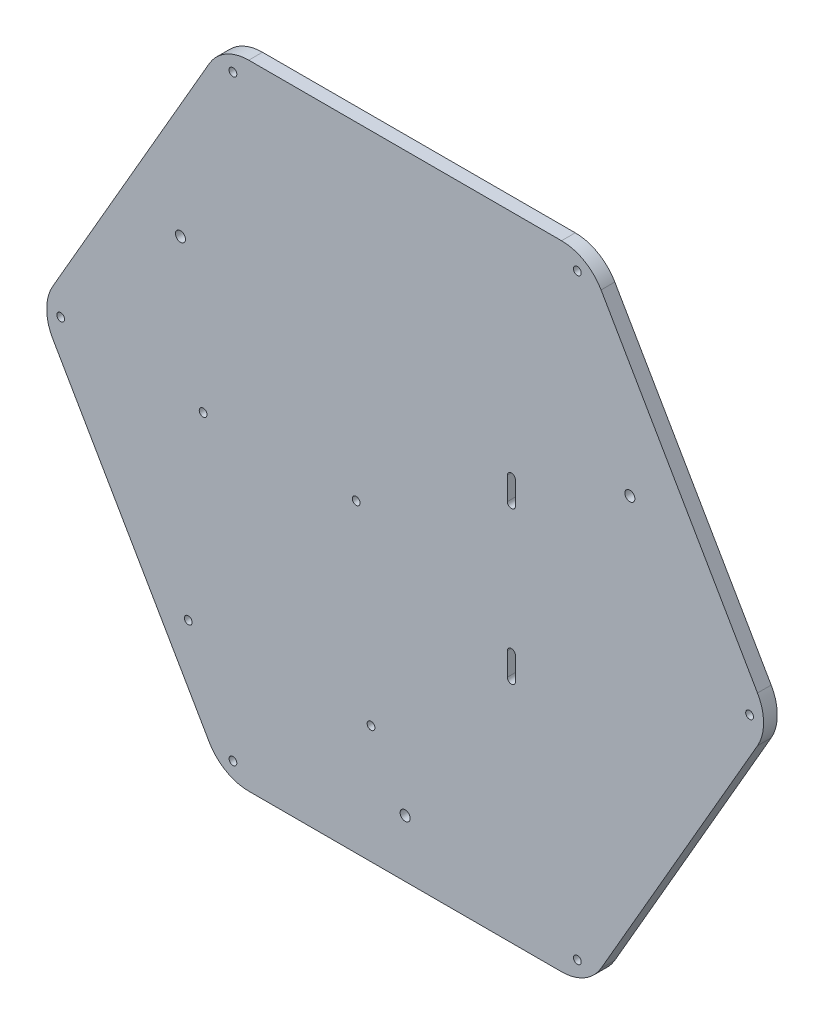
ISO-10303-21;
HEADER;
FILE_DESCRIPTION(('STEP AP214'),'2;1');
FILE_NAME('part.step','',(''),(''),'','','');
FILE_SCHEMA(('AUTOMOTIVE_DESIGN { 1 0 10303 214 1 1 1 1 }'));
ENDSEC;
DATA;
#1=APPLICATION_CONTEXT('core data for automotive mechanical design processes');
#2=APPLICATION_PROTOCOL_DEFINITION('international standard','automotive_design',2000,#1);
#3=PRODUCT_CONTEXT('',#1,'mechanical');
#4=PRODUCT('Part','Part','',(#3));
#5=PRODUCT_RELATED_PRODUCT_CATEGORY('part','',(#4));
#6=PRODUCT_DEFINITION_FORMATION('','',#4);
#7=PRODUCT_DEFINITION_CONTEXT('part definition',#1,'design');
#8=PRODUCT_DEFINITION('design','',#6,#7);
#9=PRODUCT_DEFINITION_SHAPE('','',#8);
#10=(LENGTH_UNIT() NAMED_UNIT(*) SI_UNIT(.MILLI.,.METRE.));
#11=(NAMED_UNIT(*) PLANE_ANGLE_UNIT() SI_UNIT($,.RADIAN.));
#12=(NAMED_UNIT(*) SI_UNIT($,.STERADIAN.) SOLID_ANGLE_UNIT());
#13=UNCERTAINTY_MEASURE_WITH_UNIT(LENGTH_MEASURE(1.E-05),#10,'distance_accuracy_value','');
#14=(GEOMETRIC_REPRESENTATION_CONTEXT(3) GLOBAL_UNCERTAINTY_ASSIGNED_CONTEXT((#13)) GLOBAL_UNIT_ASSIGNED_CONTEXT((#10,
#11,#12)) REPRESENTATION_CONTEXT('',''));
#15=CARTESIAN_POINT('',(0.,0.,0.));
#16=DIRECTION('',(0.,0.,1.));
#17=DIRECTION('',(1.,0.,0.));
#18=AXIS2_PLACEMENT_3D('',#15,#16,#17);
#19=CARTESIAN_POINT('',(160.,0.,6.));
#20=DIRECTION('',(-0.866025403784439,-0.5,0.));
#21=DIRECTION('',(0.5,-0.866025403784439,0.));
#22=AXIS2_PLACEMENT_3D('',#19,#20,#21);
#23=PLANE('',#22);
#24=DIRECTION('',(-0.5,0.866025403784439,0.));
#25=VECTOR('',#24,1.);
#26=CARTESIAN_POINT('',(160.,0.,0.));
#27=LINE('',#26,#25);
#28=CARTESIAN_POINT('',(154.226497308104,10.,0.));
#29=VERTEX_POINT('',#28);
#30=CARTESIAN_POINT('',(85.7735026918963,128.56406460551,0.));
#31=VERTEX_POINT('',#30);
#32=EDGE_CURVE('E313',#29,#31,#27,.T.);
#33=ORIENTED_EDGE('',*,*,#32,.T.);
#34=DIRECTION('',(0.,0.,-1.));
#35=VECTOR('',#34,1.);
#36=CARTESIAN_POINT('',(85.7735026918963,128.56406460551,6.));
#37=LINE('',#36,#35);
#38=CARTESIAN_POINT('',(85.7735026918963,128.56406460551,6.));
#39=VERTEX_POINT('',#38);
#40=EDGE_CURVE('E365',#31,#39,#37,.F.);
#41=ORIENTED_EDGE('',*,*,#40,.T.);
#42=DIRECTION('',(-0.5,0.866025403784439,0.));
#43=VECTOR('',#42,1.);
#44=CARTESIAN_POINT('',(160.,0.,6.));
#45=LINE('',#44,#43);
#46=CARTESIAN_POINT('',(154.226497308104,10.,6.));
#47=VERTEX_POINT('',#46);
#48=EDGE_CURVE('E287',#47,#39,#45,.T.);
#49=ORIENTED_EDGE('',*,*,#48,.F.);
#50=DIRECTION('',(0.,0.,-1.));
#51=VECTOR('',#50,1.);
#52=CARTESIAN_POINT('',(154.226497308104,10.,6.));
#53=LINE('',#52,#51);
#54=EDGE_CURVE('E361',#47,#29,#53,.T.);
#55=ORIENTED_EDGE('',*,*,#54,.T.);
#56=EDGE_LOOP('',(#33,#41,#49,#55));
#57=FACE_BOUND('',#56,.T.);
#58=ADVANCED_FACE('F38',(#57),#23,.F.);
#59=CARTESIAN_POINT('',(80.,138.56406460551,6.));
#60=DIRECTION('',(0.,-1.,0.));
#61=DIRECTION('',(1.,0.,0.));
#62=AXIS2_PLACEMENT_3D('',#59,#60,#61);
#63=PLANE('',#62);
#64=DIRECTION('',(-1.,0.,0.));
#65=VECTOR('',#64,1.);
#66=CARTESIAN_POINT('',(80.,138.56406460551,6.));
#67=LINE('',#66,#65);
#68=CARTESIAN_POINT('',(68.4529946162075,138.56406460551,6.));
#69=VERTEX_POINT('',#68);
#70=CARTESIAN_POINT('',(-68.4529946162075,138.56406460551,6.));
#71=VERTEX_POINT('',#70);
#72=EDGE_CURVE('E291',#69,#71,#67,.T.);
#73=ORIENTED_EDGE('',*,*,#72,.F.);
#74=DIRECTION('',(0.,0.,-1.));
#75=VECTOR('',#74,1.);
#76=CARTESIAN_POINT('',(68.4529946162075,138.56406460551,6.));
#77=LINE('',#76,#75);
#78=CARTESIAN_POINT('',(68.4529946162075,138.56406460551,0.));
#79=VERTEX_POINT('',#78);
#80=EDGE_CURVE('E339',#69,#79,#77,.T.);
#81=ORIENTED_EDGE('',*,*,#80,.T.);
#82=DIRECTION('',(-1.,0.,0.));
#83=VECTOR('',#82,1.);
#84=CARTESIAN_POINT('',(80.,138.56406460551,0.));
#85=LINE('',#84,#83);
#86=CARTESIAN_POINT('',(-68.4529946162075,138.56406460551,0.));
#87=VERTEX_POINT('',#86);
#88=EDGE_CURVE('E317',#79,#87,#85,.T.);
#89=ORIENTED_EDGE('',*,*,#88,.T.);
#90=DIRECTION('',(0.,0.,-1.));
#91=VECTOR('',#90,1.);
#92=CARTESIAN_POINT('',(-68.4529946162075,138.56406460551,6.));
#93=LINE('',#92,#91);
#94=EDGE_CURVE('E312',#87,#71,#93,.F.);
#95=ORIENTED_EDGE('',*,*,#94,.T.);
#96=EDGE_LOOP('',(#73,#81,#89,#95));
#97=FACE_BOUND('',#96,.T.);
#98=ADVANCED_FACE('F502',(#97),#63,.F.);
#99=CARTESIAN_POINT('',(-80.,138.56406460551,6.));
#100=DIRECTION('',(0.866025403784439,-0.5,0.));
#101=DIRECTION('',(0.5,0.866025403784439,0.));
#102=AXIS2_PLACEMENT_3D('',#99,#100,#101);
#103=PLANE('',#102);
#104=DIRECTION('',(-0.5,-0.866025403784439,0.));
#105=VECTOR('',#104,1.);
#106=CARTESIAN_POINT('',(-80.,138.56406460551,6.));
#107=LINE('',#106,#105);
#108=CARTESIAN_POINT('',(-85.7735026918963,128.56406460551,6.));
#109=VERTEX_POINT('',#108);
#110=CARTESIAN_POINT('',(-154.226497308104,9.99999999999995,6.));
#111=VERTEX_POINT('',#110);
#112=EDGE_CURVE('E296',#109,#111,#107,.T.);
#113=ORIENTED_EDGE('',*,*,#112,.F.);
#114=DIRECTION('',(0.,0.,-1.));
#115=VECTOR('',#114,1.);
#116=CARTESIAN_POINT('',(-85.7735026918963,128.56406460551,6.));
#117=LINE('',#116,#115);
#118=CARTESIAN_POINT('',(-85.7735026918963,128.56406460551,0.));
#119=VERTEX_POINT('',#118);
#120=EDGE_CURVE('E389',#109,#119,#117,.T.);
#121=ORIENTED_EDGE('',*,*,#120,.T.);
#122=DIRECTION('',(-0.5,-0.866025403784439,0.));
#123=VECTOR('',#122,1.);
#124=CARTESIAN_POINT('',(-80.,138.56406460551,0.));
#125=LINE('',#124,#123);
#126=CARTESIAN_POINT('',(-154.226497308104,9.99999999999995,0.));
#127=VERTEX_POINT('',#126);
#128=EDGE_CURVE('E322',#119,#127,#125,.T.);
#129=ORIENTED_EDGE('',*,*,#128,.T.);
#130=DIRECTION('',(0.,0.,-1.));
#131=VECTOR('',#130,1.);
#132=CARTESIAN_POINT('',(-154.226497308104,9.99999999999995,6.));
#133=LINE('',#132,#131);
#134=EDGE_CURVE('E386',#127,#111,#133,.F.);
#135=ORIENTED_EDGE('',*,*,#134,.T.);
#136=EDGE_LOOP('',(#113,#121,#129,#135));
#137=FACE_BOUND('',#136,.T.);
#138=ADVANCED_FACE('F508',(#137),#103,.F.);
#139=CARTESIAN_POINT('',(-160.,0.,6.));
#140=DIRECTION('',(0.866025403784438,0.5,0.));
#141=DIRECTION('',(-0.5,0.866025403784439,0.));
#142=AXIS2_PLACEMENT_3D('',#139,#140,#141);
#143=PLANE('',#142);
#144=DIRECTION('',(0.5,-0.866025403784439,0.));
#145=VECTOR('',#144,1.);
#146=CARTESIAN_POINT('',(-160.,0.,6.));
#147=LINE('',#146,#145);
#148=CARTESIAN_POINT('',(-154.226497308104,-10.,6.));
#149=VERTEX_POINT('',#148);
#150=CARTESIAN_POINT('',(-85.7735026918962,-128.56406460551,6.));
#151=VERTEX_POINT('',#150);
#152=EDGE_CURVE('E300',#149,#151,#147,.T.);
#153=ORIENTED_EDGE('',*,*,#152,.F.);
#154=DIRECTION('',(0.,0.,-1.));
#155=VECTOR('',#154,1.);
#156=CARTESIAN_POINT('',(-154.226497308104,-10.,6.));
#157=LINE('',#156,#155);
#158=CARTESIAN_POINT('',(-154.226497308104,-10.,0.));
#159=VERTEX_POINT('',#158);
#160=EDGE_CURVE('E396',#149,#159,#157,.T.);
#161=ORIENTED_EDGE('',*,*,#160,.T.);
#162=DIRECTION('',(0.5,-0.866025403784439,0.));
#163=VECTOR('',#162,1.);
#164=CARTESIAN_POINT('',(-160.,0.,0.));
#165=LINE('',#164,#163);
#166=CARTESIAN_POINT('',(-85.7735026918962,-128.56406460551,0.));
#167=VERTEX_POINT('',#166);
#168=EDGE_CURVE('E326',#159,#167,#165,.T.);
#169=ORIENTED_EDGE('',*,*,#168,.T.);
#170=DIRECTION('',(0.,0.,-1.));
#171=VECTOR('',#170,1.);
#172=CARTESIAN_POINT('',(-85.7735026918962,-128.56406460551,6.));
#173=LINE('',#172,#171);
#174=EDGE_CURVE('E393',#167,#151,#173,.F.);
#175=ORIENTED_EDGE('',*,*,#174,.T.);
#176=EDGE_LOOP('',(#153,#161,#169,#175));
#177=FACE_BOUND('',#176,.T.);
#178=ADVANCED_FACE('F567',(#177),#143,.F.);
#179=CARTESIAN_POINT('',(-79.9999999999999,-138.56406460551,6.));
#180=DIRECTION('',(0.,1.,0.));
#181=DIRECTION('',(0.,0.,1.));
#182=AXIS2_PLACEMENT_3D('',#179,#180,#181);
#183=PLANE('',#182);
#184=DIRECTION('',(1.,0.,0.));
#185=VECTOR('',#184,1.);
#186=CARTESIAN_POINT('',(-79.9999999999999,-138.56406460551,6.));
#187=LINE('',#186,#185);
#188=CARTESIAN_POINT('',(-68.4529946162074,-138.56406460551,6.));
#189=VERTEX_POINT('',#188);
#190=CARTESIAN_POINT('',(68.4529946162075,-138.56406460551,6.));
#191=VERTEX_POINT('',#190);
#192=EDGE_CURVE('E304',#189,#191,#187,.T.);
#193=ORIENTED_EDGE('',*,*,#192,.F.);
#194=DIRECTION('',(0.,0.,-1.));
#195=VECTOR('',#194,1.);
#196=CARTESIAN_POINT('',(-68.4529946162074,-138.56406460551,6.));
#197=LINE('',#196,#195);
#198=CARTESIAN_POINT('',(-68.4529946162074,-138.56406460551,0.));
#199=VERTEX_POINT('',#198);
#200=EDGE_CURVE('E403',#189,#199,#197,.T.);
#201=ORIENTED_EDGE('',*,*,#200,.T.);
#202=DIRECTION('',(1.,0.,0.));
#203=VECTOR('',#202,1.);
#204=CARTESIAN_POINT('',(-79.9999999999999,-138.56406460551,0.));
#205=LINE('',#204,#203);
#206=CARTESIAN_POINT('',(68.4529946162075,-138.56406460551,0.));
#207=VERTEX_POINT('',#206);
#208=EDGE_CURVE('E330',#199,#207,#205,.T.);
#209=ORIENTED_EDGE('',*,*,#208,.T.);
#210=DIRECTION('',(0.,0.,-1.));
#211=VECTOR('',#210,1.);
#212=CARTESIAN_POINT('',(68.4529946162075,-138.56406460551,6.));
#213=LINE('',#212,#211);
#214=EDGE_CURVE('E400',#207,#191,#213,.F.);
#215=ORIENTED_EDGE('',*,*,#214,.T.);
#216=EDGE_LOOP('',(#193,#201,#209,#215));
#217=FACE_BOUND('',#216,.T.);
#218=ADVANCED_FACE('F572',(#217),#183,.F.);
#219=CARTESIAN_POINT('',(80.,-138.56406460551,6.));
#220=DIRECTION('',(-0.866025403784439,0.5,0.));
#221=DIRECTION('',(-0.5,-0.866025403784439,0.));
#222=AXIS2_PLACEMENT_3D('',#219,#220,#221);
#223=PLANE('',#222);
#224=DIRECTION('',(0.5,0.866025403784439,0.));
#225=VECTOR('',#224,1.);
#226=CARTESIAN_POINT('',(80.,-138.56406460551,6.));
#227=LINE('',#226,#225);
#228=CARTESIAN_POINT('',(85.7735026918963,-128.56406460551,6.));
#229=VERTEX_POINT('',#228);
#230=CARTESIAN_POINT('',(154.226497308104,-9.99999999999995,6.));
#231=VERTEX_POINT('',#230);
#232=EDGE_CURVE('E308',#229,#231,#227,.T.);
#233=ORIENTED_EDGE('',*,*,#232,.F.);
#234=DIRECTION('',(0.,0.,-1.));
#235=VECTOR('',#234,1.);
#236=CARTESIAN_POINT('',(85.7735026918963,-128.56406460551,6.));
#237=LINE('',#236,#235);
#238=CARTESIAN_POINT('',(85.7735026918963,-128.56406460551,0.));
#239=VERTEX_POINT('',#238);
#240=EDGE_CURVE('E410',#229,#239,#237,.T.);
#241=ORIENTED_EDGE('',*,*,#240,.T.);
#242=DIRECTION('',(0.5,0.866025403784439,0.));
#243=VECTOR('',#242,1.);
#244=CARTESIAN_POINT('',(80.,-138.56406460551,0.));
#245=LINE('',#244,#243);
#246=CARTESIAN_POINT('',(154.226497308104,-9.99999999999995,0.));
#247=VERTEX_POINT('',#246);
#248=EDGE_CURVE('E292',#239,#247,#245,.T.);
#249=ORIENTED_EDGE('',*,*,#248,.T.);
#250=DIRECTION('',(0.,0.,-1.));
#251=VECTOR('',#250,1.);
#252=CARTESIAN_POINT('',(154.226497308104,-9.99999999999998,6.));
#253=LINE('',#252,#251);
#254=EDGE_CURVE('E407',#247,#231,#253,.F.);
#255=ORIENTED_EDGE('',*,*,#254,.T.);
#256=EDGE_LOOP('',(#233,#241,#249,#255));
#257=FACE_BOUND('',#256,.T.);
#258=ADVANCED_FACE('F544',(#257),#223,.F.);
#259=CARTESIAN_POINT('',(0.,0.,6.));
#260=DIRECTION('',(0.,0.,1.));
#261=DIRECTION('',(1.,0.,0.));
#262=AXIS2_PLACEMENT_3D('',#259,#260,#261);
#263=PLANE('',#262);
#264=CARTESIAN_POINT('',(0.,-113.56406460551,6.));
#265=DIRECTION('',(0.,0.,1.));
#266=DIRECTION('',(1.,0.,0.));
#267=AXIS2_PLACEMENT_3D('',#264,#265,#266);
#268=CIRCLE('',#267,2.19999999999999);
#269=CARTESIAN_POINT('',(2.20000000000001,-113.56406460551,6.));
#270=VERTEX_POINT('',#269);
#271=EDGE_CURVE('E478',#270,#270,#268,.T.);
#272=ORIENTED_EDGE('',*,*,#271,.F.);
#273=EDGE_LOOP('',(#272));
#274=FACE_BOUND('',#273,.T.);
#275=CARTESIAN_POINT('',(-98.3493649053888,56.7820323027556,6.));
#276=DIRECTION('',(0.,0.,1.));
#277=DIRECTION('',(1.,0.,0.));
#278=AXIS2_PLACEMENT_3D('',#275,#276,#277);
#279=CIRCLE('',#278,2.19999999999999);
#280=CARTESIAN_POINT('',(-96.1493649053888,56.7820323027556,6.));
#281=VERTEX_POINT('',#280);
#282=EDGE_CURVE('E906',#281,#281,#279,.T.);
#283=ORIENTED_EDGE('',*,*,#282,.F.);
#284=EDGE_LOOP('',(#283));
#285=FACE_BOUND('',#284,.T.);
#286=CARTESIAN_POINT('',(98.3493649053896,56.7820323027542,6.));
#287=DIRECTION('',(0.,0.,1.));
#288=DIRECTION('',(1.,0.,0.));
#289=AXIS2_PLACEMENT_3D('',#286,#287,#288);
#290=CIRCLE('',#289,2.20000000000001);
#291=CARTESIAN_POINT('',(100.54936490539,56.7820323027542,6.));
#292=VERTEX_POINT('',#291);
#293=EDGE_CURVE('E840',#292,#292,#290,.T.);
#294=ORIENTED_EDGE('',*,*,#293,.F.);
#295=EDGE_LOOP('',(#294));
#296=FACE_BOUND('',#295,.T.);
#297=CARTESIAN_POINT('',(46.5,37.8083885373264,6.));
#298=DIRECTION('',(0.,0.,1.));
#299=DIRECTION('',(1.,0.,0.));
#300=AXIS2_PLACEMENT_3D('',#297,#298,#299);
#301=CIRCLE('',#300,1.75);
#302=CARTESIAN_POINT('',(48.25,37.8083885373264,6.));
#303=VERTEX_POINT('',#302);
#304=CARTESIAN_POINT('',(44.75,37.8083885373264,6.));
#305=VERTEX_POINT('',#304);
#306=EDGE_CURVE('E56',#303,#305,#301,.T.);
#307=ORIENTED_EDGE('',*,*,#306,.F.);
#308=DIRECTION('',(0.,1.,0.));
#309=VECTOR('',#308,1.);
#310=CARTESIAN_POINT('',(48.25,37.8083885373264,6.));
#311=LINE('',#310,#309);
#312=CARTESIAN_POINT('',(48.25,27.8083885373264,6.));
#313=VERTEX_POINT('',#312);
#314=EDGE_CURVE('E204',#313,#303,#311,.T.);
#315=ORIENTED_EDGE('',*,*,#314,.F.);
#316=CARTESIAN_POINT('',(46.5,27.8083885373264,6.));
#317=DIRECTION('',(0.,0.,1.));
#318=DIRECTION('',(1.,0.,0.));
#319=AXIS2_PLACEMENT_3D('',#316,#317,#318);
#320=CIRCLE('',#319,1.75);
#321=CARTESIAN_POINT('',(44.75,27.8083885373264,6.));
#322=VERTEX_POINT('',#321);
#323=EDGE_CURVE('E185',#322,#313,#320,.T.);
#324=ORIENTED_EDGE('',*,*,#323,.F.);
#325=DIRECTION('',(0.,-1.,0.));
#326=VECTOR('',#325,1.);
#327=CARTESIAN_POINT('',(44.75,37.8083885373264,6.));
#328=LINE('',#327,#326);
#329=EDGE_CURVE('E196',#305,#322,#328,.T.);
#330=ORIENTED_EDGE('',*,*,#329,.F.);
#331=EDGE_LOOP('',(#307,#315,#324,#330));
#332=FACE_BOUND('',#331,.T.);
#333=CARTESIAN_POINT('',(46.5,-38.75,6.));
#334=DIRECTION('',(0.,0.,1.));
#335=DIRECTION('',(-1.,0.,0.));
#336=AXIS2_PLACEMENT_3D('',#333,#334,#335);
#337=CIRCLE('',#336,1.75);
#338=CARTESIAN_POINT('',(44.75,-38.75,6.));
#339=VERTEX_POINT('',#338);
#340=CARTESIAN_POINT('',(48.25,-38.75,6.));
#341=VERTEX_POINT('',#340);
#342=EDGE_CURVE('E64',#339,#341,#337,.T.);
#343=ORIENTED_EDGE('',*,*,#342,.F.);
#344=DIRECTION('',(0.,-1.,0.));
#345=VECTOR('',#344,1.);
#346=CARTESIAN_POINT('',(44.75,-38.75,6.));
#347=LINE('',#346,#345);
#348=CARTESIAN_POINT('',(44.75,-28.75,6.));
#349=VERTEX_POINT('',#348);
#350=EDGE_CURVE('E229',#349,#339,#347,.T.);
#351=ORIENTED_EDGE('',*,*,#350,.F.);
#352=CARTESIAN_POINT('',(46.5,-28.75,6.));
#353=DIRECTION('',(0.,0.,1.));
#354=DIRECTION('',(-1.,0.,0.));
#355=AXIS2_PLACEMENT_3D('',#352,#353,#354);
#356=CIRCLE('',#355,1.75);
#357=CARTESIAN_POINT('',(48.25,-28.75,6.));
#358=VERTEX_POINT('',#357);
#359=EDGE_CURVE('E225',#358,#349,#356,.T.);
#360=ORIENTED_EDGE('',*,*,#359,.F.);
#361=DIRECTION('',(0.,1.,0.));
#362=VECTOR('',#361,1.);
#363=CARTESIAN_POINT('',(48.25,-38.75,6.));
#364=LINE('',#363,#362);
#365=EDGE_CURVE('E221',#341,#358,#364,.T.);
#366=ORIENTED_EDGE('',*,*,#365,.F.);
#367=EDGE_LOOP('',(#343,#351,#360,#366));
#368=FACE_BOUND('',#367,.T.);
#369=CARTESIAN_POINT('',(-94.9374269543262,-87.,6.));
#370=DIRECTION('',(0.,0.,1.));
#371=DIRECTION('',(-1.,0.,0.));
#372=AXIS2_PLACEMENT_3D('',#369,#370,#371);
#373=CIRCLE('',#372,1.7);
#374=CARTESIAN_POINT('',(-96.6374269543262,-87.,6.));
#375=VERTEX_POINT('',#374);
#376=EDGE_CURVE('E214',#375,#375,#373,.T.);
#377=ORIENTED_EDGE('',*,*,#376,.F.);
#378=EDGE_LOOP('',(#377));
#379=FACE_BOUND('',#378,.T.);
#380=CARTESIAN_POINT('',(-14.9374269543263,-87.,6.));
#381=DIRECTION('',(0.,0.,1.));
#382=DIRECTION('',(-1.,0.,0.));
#383=AXIS2_PLACEMENT_3D('',#380,#381,#382);
#384=CIRCLE('',#383,1.7);
#385=CARTESIAN_POINT('',(-16.6374269543263,-87.,6.));
#386=VERTEX_POINT('',#385);
#387=EDGE_CURVE('E250',#386,#386,#384,.T.);
#388=ORIENTED_EDGE('',*,*,#387,.F.);
#389=EDGE_LOOP('',(#388));
#390=FACE_BOUND('',#389,.T.);
#391=CARTESIAN_POINT('',(-21.4374269543263,-5.00000000000003,6.));
#392=DIRECTION('',(0.,0.,1.));
#393=DIRECTION('',(-1.,0.,0.));
#394=AXIS2_PLACEMENT_3D('',#391,#392,#393);
#395=CIRCLE('',#394,1.7);
#396=CARTESIAN_POINT('',(-23.1374269543263,-5.00000000000003,6.));
#397=VERTEX_POINT('',#396);
#398=EDGE_CURVE('E245',#397,#397,#395,.T.);
#399=ORIENTED_EDGE('',*,*,#398,.F.);
#400=EDGE_LOOP('',(#399));
#401=FACE_BOUND('',#400,.T.);
#402=CARTESIAN_POINT('',(-88.4374269543263,-5.00000000000005,6.));
#403=DIRECTION('',(0.,0.,1.));
#404=DIRECTION('',(1.,0.,0.));
#405=AXIS2_PLACEMENT_3D('',#402,#403,#404);
#406=CIRCLE('',#405,1.7);
#407=CARTESIAN_POINT('',(-86.7374269543263,-5.00000000000005,6.));
#408=VERTEX_POINT('',#407);
#409=EDGE_CURVE('E249',#408,#408,#406,.T.);
#410=ORIENTED_EDGE('',*,*,#409,.F.);
#411=EDGE_LOOP('',(#410));
#412=FACE_BOUND('',#411,.T.);
#413=CARTESIAN_POINT('',(150.762395692966,-1.26287869051112E-12,6.));
#414=DIRECTION('',(0.,0.,1.));
#415=DIRECTION('',(1.,0.,0.));
#416=AXIS2_PLACEMENT_3D('',#413,#414,#415);
#417=CIRCLE('',#416,1.70000000000001);
#418=CARTESIAN_POINT('',(152.462395692966,-1.26287869051112E-12,6.));
#419=VERTEX_POINT('',#418);
#420=EDGE_CURVE('E265',#419,#419,#417,.T.);
#421=ORIENTED_EDGE('',*,*,#420,.F.);
#422=EDGE_LOOP('',(#421));
#423=FACE_BOUND('',#422,.T.);
#424=CARTESIAN_POINT('',(-150.762395692966,7.07767178198537E-13,6.));
#425=DIRECTION('',(0.,0.,1.));
#426=DIRECTION('',(-1.,0.,0.));
#427=AXIS2_PLACEMENT_3D('',#424,#425,#426);
#428=CIRCLE('',#427,1.69999999999998);
#429=CARTESIAN_POINT('',(-152.462395692966,7.07767178198537E-13,6.));
#430=VERTEX_POINT('',#429);
#431=EDGE_CURVE('E267',#430,#430,#428,.T.);
#432=ORIENTED_EDGE('',*,*,#431,.F.);
#433=EDGE_LOOP('',(#432));
#434=FACE_BOUND('',#433,.T.);
#435=CARTESIAN_POINT('',(-75.3811978464825,130.56406460551,6.));
#436=DIRECTION('',(0.,0.,1.));
#437=DIRECTION('',(1.,0.,0.));
#438=AXIS2_PLACEMENT_3D('',#435,#436,#437);
#439=CIRCLE('',#438,1.69999999999999);
#440=CARTESIAN_POINT('',(-73.6811978464825,130.56406460551,6.));
#441=VERTEX_POINT('',#440);
#442=EDGE_CURVE('E271',#441,#441,#439,.T.);
#443=ORIENTED_EDGE('',*,*,#442,.F.);
#444=EDGE_LOOP('',(#443));
#445=FACE_BOUND('',#444,.T.);
#446=CARTESIAN_POINT('',(75.381197846483,-130.56406460551,6.));
#447=DIRECTION('',(0.,0.,1.));
#448=DIRECTION('',(-1.,0.,0.));
#449=AXIS2_PLACEMENT_3D('',#446,#447,#448);
#450=CIRCLE('',#449,1.7);
#451=CARTESIAN_POINT('',(73.681197846483,-130.56406460551,6.));
#452=VERTEX_POINT('',#451);
#453=EDGE_CURVE('E275',#452,#452,#450,.T.);
#454=ORIENTED_EDGE('',*,*,#453,.F.);
#455=EDGE_LOOP('',(#454));
#456=FACE_BOUND('',#455,.T.);
#457=CARTESIAN_POINT('',(75.3811978464842,130.564064605509,6.));
#458=DIRECTION('',(0.,0.,1.));
#459=DIRECTION('',(-1.,0.,0.));
#460=AXIS2_PLACEMENT_3D('',#457,#458,#459);
#461=CIRCLE('',#460,1.69999999999999);
#462=CARTESIAN_POINT('',(73.6811978464842,130.564064605509,6.));
#463=VERTEX_POINT('',#462);
#464=EDGE_CURVE('E261',#463,#463,#461,.T.);
#465=ORIENTED_EDGE('',*,*,#464,.F.);
#466=EDGE_LOOP('',(#465));
#467=FACE_BOUND('',#466,.T.);
#468=CARTESIAN_POINT('',(-75.3811978464829,-130.56406460551,6.));
#469=DIRECTION('',(0.,0.,1.));
#470=DIRECTION('',(1.,0.,0.));
#471=AXIS2_PLACEMENT_3D('',#468,#469,#470);
#472=CIRCLE('',#471,1.7);
#473=CARTESIAN_POINT('',(-73.6811978464829,-130.56406460551,6.));
#474=VERTEX_POINT('',#473);
#475=EDGE_CURVE('E279',#474,#474,#472,.T.);
#476=ORIENTED_EDGE('',*,*,#475,.F.);
#477=EDGE_LOOP('',(#476));
#478=FACE_BOUND('',#477,.T.);
#479=ORIENTED_EDGE('',*,*,#48,.T.);
#480=CARTESIAN_POINT('',(68.4529946162075,118.56406460551,6.));
#481=DIRECTION('',(0.,0.,1.));
#482=DIRECTION('',(1.,0.,0.));
#483=AXIS2_PLACEMENT_3D('',#480,#481,#482);
#484=CIRCLE('',#483,20.);
#485=EDGE_CURVE('E383',#39,#69,#484,.T.);
#486=ORIENTED_EDGE('',*,*,#485,.T.);
#487=ORIENTED_EDGE('',*,*,#72,.T.);
#488=CARTESIAN_POINT('',(-68.4529946162075,118.56406460551,6.));
#489=DIRECTION('',(0.,0.,1.));
#490=DIRECTION('',(1.,0.,0.));
#491=AXIS2_PLACEMENT_3D('',#488,#489,#490);
#492=CIRCLE('',#491,20.);
#493=EDGE_CURVE('E380',#71,#109,#492,.T.);
#494=ORIENTED_EDGE('',*,*,#493,.T.);
#495=ORIENTED_EDGE('',*,*,#112,.T.);
#496=CARTESIAN_POINT('',(-136.905989232415,0.,6.));
#497=DIRECTION('',(0.,0.,1.));
#498=DIRECTION('',(1.,0.,0.));
#499=AXIS2_PLACEMENT_3D('',#496,#497,#498);
#500=CIRCLE('',#499,20.);
#501=EDGE_CURVE('E377',#111,#149,#500,.T.);
#502=ORIENTED_EDGE('',*,*,#501,.T.);
#503=ORIENTED_EDGE('',*,*,#152,.T.);
#504=CARTESIAN_POINT('',(-68.4529946162074,-118.56406460551,6.));
#505=DIRECTION('',(0.,0.,1.));
#506=DIRECTION('',(1.,0.,0.));
#507=AXIS2_PLACEMENT_3D('',#504,#505,#506);
#508=CIRCLE('',#507,20.);
#509=EDGE_CURVE('E374',#151,#189,#508,.T.);
#510=ORIENTED_EDGE('',*,*,#509,.T.);
#511=ORIENTED_EDGE('',*,*,#192,.T.);
#512=CARTESIAN_POINT('',(68.4529946162075,-118.56406460551,6.));
#513=DIRECTION('',(0.,0.,1.));
#514=DIRECTION('',(1.,0.,0.));
#515=AXIS2_PLACEMENT_3D('',#512,#513,#514);
#516=CIRCLE('',#515,20.);
#517=EDGE_CURVE('E371',#191,#229,#516,.T.);
#518=ORIENTED_EDGE('',*,*,#517,.T.);
#519=ORIENTED_EDGE('',*,*,#232,.T.);
#520=CARTESIAN_POINT('',(136.905989232415,0.,6.));
#521=DIRECTION('',(0.,0.,1.));
#522=DIRECTION('',(1.,0.,0.));
#523=AXIS2_PLACEMENT_3D('',#520,#521,#522);
#524=CIRCLE('',#523,20.);
#525=EDGE_CURVE('E368',#231,#47,#524,.T.);
#526=ORIENTED_EDGE('',*,*,#525,.T.);
#527=EDGE_LOOP('',(#479,#486,#487,#494,#495,#502,#503,#510,#511,#518,#519,#526));
#528=FACE_BOUND('',#527,.T.);
#529=ADVANCED_FACE('F201',(#274,#285,#296,#332,#368,#379,#390,#401,#412,#423,#434,#445,#456,
#467,#478,#528),#263,.T.);
#530=CARTESIAN_POINT('',(0.,0.,0.));
#531=DIRECTION('',(0.,0.,1.));
#532=DIRECTION('',(1.,0.,0.));
#533=AXIS2_PLACEMENT_3D('',#530,#531,#532);
#534=PLANE('',#533);
#535=CARTESIAN_POINT('',(0.,-113.56406460551,0.));
#536=DIRECTION('',(0.,0.,1.));
#537=DIRECTION('',(1.,0.,0.));
#538=AXIS2_PLACEMENT_3D('',#535,#536,#537);
#539=CIRCLE('',#538,2.19999999999999);
#540=CARTESIAN_POINT('',(2.20000000000001,-113.56406460551,0.));
#541=VERTEX_POINT('',#540);
#542=EDGE_CURVE('E42',#541,#541,#539,.T.);
#543=ORIENTED_EDGE('',*,*,#542,.T.);
#544=EDGE_LOOP('',(#543));
#545=FACE_BOUND('',#544,.T.);
#546=CARTESIAN_POINT('',(-98.3493649053888,56.7820323027556,0.));
#547=DIRECTION('',(0.,0.,1.));
#548=DIRECTION('',(1.,0.,0.));
#549=AXIS2_PLACEMENT_3D('',#546,#547,#548);
#550=CIRCLE('',#549,2.19999999999999);
#551=CARTESIAN_POINT('',(-96.1493649053888,56.7820323027556,0.));
#552=VERTEX_POINT('',#551);
#553=EDGE_CURVE('E477',#552,#552,#550,.T.);
#554=ORIENTED_EDGE('',*,*,#553,.T.);
#555=EDGE_LOOP('',(#554));
#556=FACE_BOUND('',#555,.T.);
#557=CARTESIAN_POINT('',(98.3493649053896,56.7820323027542,0.));
#558=DIRECTION('',(0.,0.,1.));
#559=DIRECTION('',(1.,0.,0.));
#560=AXIS2_PLACEMENT_3D('',#557,#558,#559);
#561=CIRCLE('',#560,2.20000000000001);
#562=CARTESIAN_POINT('',(100.54936490539,56.7820323027542,0.));
#563=VERTEX_POINT('',#562);
#564=EDGE_CURVE('E474',#563,#563,#561,.T.);
#565=ORIENTED_EDGE('',*,*,#564,.T.);
#566=EDGE_LOOP('',(#565));
#567=FACE_BOUND('',#566,.T.);
#568=DIRECTION('',(0.,1.,0.));
#569=VECTOR('',#568,1.);
#570=CARTESIAN_POINT('',(48.25,0.,0.));
#571=LINE('',#570,#569);
#572=CARTESIAN_POINT('',(48.25,27.8083885373264,0.));
#573=VERTEX_POINT('',#572);
#574=CARTESIAN_POINT('',(48.25,37.8083885373264,0.));
#575=VERTEX_POINT('',#574);
#576=EDGE_CURVE('E48',#573,#575,#571,.T.);
#577=ORIENTED_EDGE('',*,*,#576,.T.);
#578=CARTESIAN_POINT('',(46.5,37.8083885373264,0.));
#579=DIRECTION('',(0.,0.,1.));
#580=DIRECTION('',(1.,0.,0.));
#581=AXIS2_PLACEMENT_3D('',#578,#579,#580);
#582=CIRCLE('',#581,1.75);
#583=CARTESIAN_POINT('',(44.75,37.8083885373264,0.));
#584=VERTEX_POINT('',#583);
#585=EDGE_CURVE('E11',#575,#584,#582,.T.);
#586=ORIENTED_EDGE('',*,*,#585,.T.);
#587=DIRECTION('',(0.,-1.,0.));
#588=VECTOR('',#587,1.);
#589=CARTESIAN_POINT('',(44.75,0.,0.));
#590=LINE('',#589,#588);
#591=CARTESIAN_POINT('',(44.75,27.8083885373264,0.));
#592=VERTEX_POINT('',#591);
#593=EDGE_CURVE('E466',#584,#592,#590,.T.);
#594=ORIENTED_EDGE('',*,*,#593,.T.);
#595=CARTESIAN_POINT('',(46.5,27.8083885373264,0.));
#596=DIRECTION('',(0.,0.,1.));
#597=DIRECTION('',(1.,0.,0.));
#598=AXIS2_PLACEMENT_3D('',#595,#596,#597);
#599=CIRCLE('',#598,1.75);
#600=EDGE_CURVE('E188',#592,#573,#599,.T.);
#601=ORIENTED_EDGE('',*,*,#600,.T.);
#602=EDGE_LOOP('',(#577,#586,#594,#601));
#603=FACE_BOUND('',#602,.T.);
#604=DIRECTION('',(0.,-1.,0.));
#605=VECTOR('',#604,1.);
#606=CARTESIAN_POINT('',(44.75,0.,0.));
#607=LINE('',#606,#605);
#608=CARTESIAN_POINT('',(44.75,-28.75,0.));
#609=VERTEX_POINT('',#608);
#610=CARTESIAN_POINT('',(44.75,-38.75,0.));
#611=VERTEX_POINT('',#610);
#612=EDGE_CURVE('E458',#609,#611,#607,.T.);
#613=ORIENTED_EDGE('',*,*,#612,.T.);
#614=CARTESIAN_POINT('',(46.5,-38.75,0.));
#615=DIRECTION('',(0.,0.,1.));
#616=DIRECTION('',(1.,0.,0.));
#617=AXIS2_PLACEMENT_3D('',#614,#615,#616);
#618=CIRCLE('',#617,1.75);
#619=CARTESIAN_POINT('',(48.25,-38.75,0.));
#620=VERTEX_POINT('',#619);
#621=EDGE_CURVE('E462',#611,#620,#618,.T.);
#622=ORIENTED_EDGE('',*,*,#621,.T.);
#623=DIRECTION('',(0.,1.,0.));
#624=VECTOR('',#623,1.);
#625=CARTESIAN_POINT('',(48.25,0.,0.));
#626=LINE('',#625,#624);
#627=CARTESIAN_POINT('',(48.25,-28.75,0.));
#628=VERTEX_POINT('',#627);
#629=EDGE_CURVE('E414',#620,#628,#626,.T.);
#630=ORIENTED_EDGE('',*,*,#629,.T.);
#631=CARTESIAN_POINT('',(46.5,-28.75,0.));
#632=DIRECTION('',(0.,0.,1.));
#633=DIRECTION('',(1.,0.,0.));
#634=AXIS2_PLACEMENT_3D('',#631,#632,#633);
#635=CIRCLE('',#634,1.75);
#636=EDGE_CURVE('E454',#628,#609,#635,.T.);
#637=ORIENTED_EDGE('',*,*,#636,.T.);
#638=EDGE_LOOP('',(#613,#622,#630,#637));
#639=FACE_BOUND('',#638,.T.);
#640=CARTESIAN_POINT('',(-94.9374269543262,-87.,0.));
#641=DIRECTION('',(0.,0.,1.));
#642=DIRECTION('',(1.,0.,0.));
#643=AXIS2_PLACEMENT_3D('',#640,#641,#642);
#644=CIRCLE('',#643,1.7);
#645=CARTESIAN_POINT('',(-93.2374269543263,-87.,0.));
#646=VERTEX_POINT('',#645);
#647=EDGE_CURVE('E266',#646,#646,#644,.T.);
#648=ORIENTED_EDGE('',*,*,#647,.T.);
#649=EDGE_LOOP('',(#648));
#650=FACE_BOUND('',#649,.T.);
#651=CARTESIAN_POINT('',(-14.9374269543263,-87.,0.));
#652=DIRECTION('',(0.,0.,1.));
#653=DIRECTION('',(1.,0.,0.));
#654=AXIS2_PLACEMENT_3D('',#651,#652,#653);
#655=CIRCLE('',#654,1.7);
#656=CARTESIAN_POINT('',(-13.2374269543263,-87.,0.));
#657=VERTEX_POINT('',#656);
#658=EDGE_CURVE('E444',#657,#657,#655,.T.);
#659=ORIENTED_EDGE('',*,*,#658,.T.);
#660=EDGE_LOOP('',(#659));
#661=FACE_BOUND('',#660,.T.);
#662=CARTESIAN_POINT('',(-21.4374269543263,-5.00000000000003,0.));
#663=DIRECTION('',(0.,0.,1.));
#664=DIRECTION('',(1.,0.,0.));
#665=AXIS2_PLACEMENT_3D('',#662,#663,#664);
#666=CIRCLE('',#665,1.7);
#667=CARTESIAN_POINT('',(-19.7374269543263,-5.00000000000003,0.));
#668=VERTEX_POINT('',#667);
#669=EDGE_CURVE('E440',#668,#668,#666,.T.);
#670=ORIENTED_EDGE('',*,*,#669,.T.);
#671=EDGE_LOOP('',(#670));
#672=FACE_BOUND('',#671,.T.);
#673=CARTESIAN_POINT('',(-88.4374269543263,-5.00000000000005,0.));
#674=DIRECTION('',(0.,0.,1.));
#675=DIRECTION('',(1.,0.,0.));
#676=AXIS2_PLACEMENT_3D('',#673,#674,#675);
#677=CIRCLE('',#676,1.7);
#678=CARTESIAN_POINT('',(-86.7374269543263,-5.00000000000005,0.));
#679=VERTEX_POINT('',#678);
#680=EDGE_CURVE('E260',#679,#679,#677,.T.);
#681=ORIENTED_EDGE('',*,*,#680,.T.);
#682=EDGE_LOOP('',(#681));
#683=FACE_BOUND('',#682,.T.);
#684=CARTESIAN_POINT('',(150.762395692966,-1.26287869051112E-12,0.));
#685=DIRECTION('',(0.,0.,1.));
#686=DIRECTION('',(1.,0.,0.));
#687=AXIS2_PLACEMENT_3D('',#684,#685,#686);
#688=CIRCLE('',#687,1.70000000000001);
#689=CARTESIAN_POINT('',(152.462395692966,-1.26287869051112E-12,0.));
#690=VERTEX_POINT('',#689);
#691=EDGE_CURVE('E318',#690,#690,#688,.T.);
#692=ORIENTED_EDGE('',*,*,#691,.T.);
#693=EDGE_LOOP('',(#692));
#694=FACE_BOUND('',#693,.T.);
#695=CARTESIAN_POINT('',(-150.762395692966,7.07767178198537E-13,0.));
#696=DIRECTION('',(0.,0.,1.));
#697=DIRECTION('',(1.,0.,0.));
#698=AXIS2_PLACEMENT_3D('',#695,#696,#697);
#699=CIRCLE('',#698,1.69999999999998);
#700=CARTESIAN_POINT('',(-149.062395692966,7.07767178198537E-13,0.));
#701=VERTEX_POINT('',#700);
#702=EDGE_CURVE('E430',#701,#701,#699,.T.);
#703=ORIENTED_EDGE('',*,*,#702,.T.);
#704=EDGE_LOOP('',(#703));
#705=FACE_BOUND('',#704,.T.);
#706=CARTESIAN_POINT('',(-75.3811978464825,130.56406460551,0.));
#707=DIRECTION('',(0.,0.,1.));
#708=DIRECTION('',(1.,0.,0.));
#709=AXIS2_PLACEMENT_3D('',#706,#707,#708);
#710=CIRCLE('',#709,1.69999999999999);
#711=CARTESIAN_POINT('',(-73.6811978464825,130.56406460551,0.));
#712=VERTEX_POINT('',#711);
#713=EDGE_CURVE('E426',#712,#712,#710,.T.);
#714=ORIENTED_EDGE('',*,*,#713,.T.);
#715=EDGE_LOOP('',(#714));
#716=FACE_BOUND('',#715,.T.);
#717=CARTESIAN_POINT('',(75.381197846483,-130.56406460551,0.));
#718=DIRECTION('',(0.,0.,1.));
#719=DIRECTION('',(1.,0.,0.));
#720=AXIS2_PLACEMENT_3D('',#717,#718,#719);
#721=CIRCLE('',#720,1.7);
#722=CARTESIAN_POINT('',(77.081197846483,-130.56406460551,0.));
#723=VERTEX_POINT('',#722);
#724=EDGE_CURVE('E422',#723,#723,#721,.T.);
#725=ORIENTED_EDGE('',*,*,#724,.T.);
#726=EDGE_LOOP('',(#725));
#727=FACE_BOUND('',#726,.T.);
#728=CARTESIAN_POINT('',(75.3811978464842,130.564064605509,0.));
#729=DIRECTION('',(0.,0.,1.));
#730=DIRECTION('',(1.,0.,0.));
#731=AXIS2_PLACEMENT_3D('',#728,#729,#730);
#732=CIRCLE('',#731,1.69999999999999);
#733=CARTESIAN_POINT('',(77.0811978464842,130.564064605509,0.));
#734=VERTEX_POINT('',#733);
#735=EDGE_CURVE('E418',#734,#734,#732,.T.);
#736=ORIENTED_EDGE('',*,*,#735,.T.);
#737=EDGE_LOOP('',(#736));
#738=FACE_BOUND('',#737,.T.);
#739=CARTESIAN_POINT('',(-75.3811978464829,-130.56406460551,0.));
#740=DIRECTION('',(0.,0.,1.));
#741=DIRECTION('',(1.,0.,0.));
#742=AXIS2_PLACEMENT_3D('',#739,#740,#741);
#743=CIRCLE('',#742,1.7);
#744=CARTESIAN_POINT('',(-73.6811978464829,-130.56406460551,0.));
#745=VERTEX_POINT('',#744);
#746=EDGE_CURVE('E286',#745,#745,#743,.T.);
#747=ORIENTED_EDGE('',*,*,#746,.T.);
#748=EDGE_LOOP('',(#747));
#749=FACE_BOUND('',#748,.T.);
#750=ORIENTED_EDGE('',*,*,#88,.F.);
#751=CARTESIAN_POINT('',(68.4529946162075,118.56406460551,0.));
#752=DIRECTION('',(0.,0.,1.));
#753=DIRECTION('',(1.,0.,0.));
#754=AXIS2_PLACEMENT_3D('',#751,#752,#753);
#755=CIRCLE('',#754,20.);
#756=EDGE_CURVE('E358',#79,#31,#755,.F.);
#757=ORIENTED_EDGE('',*,*,#756,.T.);
#758=ORIENTED_EDGE('',*,*,#32,.F.);
#759=CARTESIAN_POINT('',(136.905989232415,0.,0.));
#760=DIRECTION('',(0.,0.,1.));
#761=DIRECTION('',(1.,0.,0.));
#762=AXIS2_PLACEMENT_3D('',#759,#760,#761);
#763=CIRCLE('',#762,20.);
#764=EDGE_CURVE('E343',#29,#247,#763,.F.);
#765=ORIENTED_EDGE('',*,*,#764,.T.);
#766=ORIENTED_EDGE('',*,*,#248,.F.);
#767=CARTESIAN_POINT('',(68.4529946162075,-118.56406460551,0.));
#768=DIRECTION('',(0.,0.,1.));
#769=DIRECTION('',(1.,0.,0.));
#770=AXIS2_PLACEMENT_3D('',#767,#768,#769);
#771=CIRCLE('',#770,20.);
#772=EDGE_CURVE('E346',#239,#207,#771,.F.);
#773=ORIENTED_EDGE('',*,*,#772,.T.);
#774=ORIENTED_EDGE('',*,*,#208,.F.);
#775=CARTESIAN_POINT('',(-68.4529946162074,-118.56406460551,0.));
#776=DIRECTION('',(0.,0.,1.));
#777=DIRECTION('',(1.,0.,0.));
#778=AXIS2_PLACEMENT_3D('',#775,#776,#777);
#779=CIRCLE('',#778,20.);
#780=EDGE_CURVE('E349',#199,#167,#779,.F.);
#781=ORIENTED_EDGE('',*,*,#780,.T.);
#782=ORIENTED_EDGE('',*,*,#168,.F.);
#783=CARTESIAN_POINT('',(-136.905989232415,0.,0.));
#784=DIRECTION('',(0.,0.,1.));
#785=DIRECTION('',(1.,0.,0.));
#786=AXIS2_PLACEMENT_3D('',#783,#784,#785);
#787=CIRCLE('',#786,20.);
#788=EDGE_CURVE('E352',#159,#127,#787,.F.);
#789=ORIENTED_EDGE('',*,*,#788,.T.);
#790=ORIENTED_EDGE('',*,*,#128,.F.);
#791=CARTESIAN_POINT('',(-68.4529946162075,118.56406460551,0.));
#792=DIRECTION('',(0.,0.,1.));
#793=DIRECTION('',(1.,0.,0.));
#794=AXIS2_PLACEMENT_3D('',#791,#792,#793);
#795=CIRCLE('',#794,20.);
#796=EDGE_CURVE('E355',#119,#87,#795,.F.);
#797=ORIENTED_EDGE('',*,*,#796,.T.);
#798=EDGE_LOOP('',(#750,#757,#758,#765,#766,#773,#774,#781,#782,#789,#790,#797));
#799=FACE_BOUND('',#798,.T.);
#800=ADVANCED_FACE('F487',(#545,#556,#567,#603,#639,#650,#661,#672,#683,#694,#705,#716,#727,
#738,#749,#799),#534,.F.);
#801=CARTESIAN_POINT('',(68.4529946162075,118.56406460551,6.));
#802=DIRECTION('',(0.,0.,-1.));
#803=DIRECTION('',(-1.,0.,0.));
#804=AXIS2_PLACEMENT_3D('',#801,#802,#803);
#805=CYLINDRICAL_SURFACE('',#804,20.);
#806=ORIENTED_EDGE('',*,*,#485,.F.);
#807=ORIENTED_EDGE('',*,*,#40,.F.);
#808=ORIENTED_EDGE('',*,*,#756,.F.);
#809=ORIENTED_EDGE('',*,*,#80,.F.);
#810=EDGE_LOOP('',(#806,#807,#808,#809));
#811=FACE_BOUND('',#810,.T.);
#812=ADVANCED_FACE('F513',(#811),#805,.T.);
#813=CARTESIAN_POINT('',(-68.4529946162075,118.56406460551,6.));
#814=DIRECTION('',(0.,0.,-1.));
#815=DIRECTION('',(-1.,0.,0.));
#816=AXIS2_PLACEMENT_3D('',#813,#814,#815);
#817=CYLINDRICAL_SURFACE('',#816,20.);
#818=ORIENTED_EDGE('',*,*,#493,.F.);
#819=ORIENTED_EDGE('',*,*,#94,.F.);
#820=ORIENTED_EDGE('',*,*,#796,.F.);
#821=ORIENTED_EDGE('',*,*,#120,.F.);
#822=EDGE_LOOP('',(#818,#819,#820,#821));
#823=FACE_BOUND('',#822,.T.);
#824=ADVANCED_FACE('F516',(#823),#817,.T.);
#825=CARTESIAN_POINT('',(-136.905989232415,0.,6.));
#826=DIRECTION('',(0.,0.,-1.));
#827=DIRECTION('',(-1.,0.,0.));
#828=AXIS2_PLACEMENT_3D('',#825,#826,#827);
#829=CYLINDRICAL_SURFACE('',#828,20.);
#830=ORIENTED_EDGE('',*,*,#501,.F.);
#831=ORIENTED_EDGE('',*,*,#134,.F.);
#832=ORIENTED_EDGE('',*,*,#788,.F.);
#833=ORIENTED_EDGE('',*,*,#160,.F.);
#834=EDGE_LOOP('',(#830,#831,#832,#833));
#835=FACE_BOUND('',#834,.T.);
#836=ADVANCED_FACE('F520',(#835),#829,.T.);
#837=CARTESIAN_POINT('',(-68.4529946162074,-118.56406460551,6.));
#838=DIRECTION('',(0.,0.,-1.));
#839=DIRECTION('',(-1.,0.,0.));
#840=AXIS2_PLACEMENT_3D('',#837,#838,#839);
#841=CYLINDRICAL_SURFACE('',#840,20.);
#842=ORIENTED_EDGE('',*,*,#509,.F.);
#843=ORIENTED_EDGE('',*,*,#174,.F.);
#844=ORIENTED_EDGE('',*,*,#780,.F.);
#845=ORIENTED_EDGE('',*,*,#200,.F.);
#846=EDGE_LOOP('',(#842,#843,#844,#845));
#847=FACE_BOUND('',#846,.T.);
#848=ADVANCED_FACE('F524',(#847),#841,.T.);
#849=CARTESIAN_POINT('',(68.4529946162075,-118.56406460551,6.));
#850=DIRECTION('',(0.,0.,-1.));
#851=DIRECTION('',(-1.,0.,0.));
#852=AXIS2_PLACEMENT_3D('',#849,#850,#851);
#853=CYLINDRICAL_SURFACE('',#852,20.);
#854=ORIENTED_EDGE('',*,*,#517,.F.);
#855=ORIENTED_EDGE('',*,*,#214,.F.);
#856=ORIENTED_EDGE('',*,*,#772,.F.);
#857=ORIENTED_EDGE('',*,*,#240,.F.);
#858=EDGE_LOOP('',(#854,#855,#856,#857));
#859=FACE_BOUND('',#858,.T.);
#860=ADVANCED_FACE('F527',(#859),#853,.T.);
#861=CARTESIAN_POINT('',(136.905989232415,0.,6.));
#862=DIRECTION('',(0.,0.,-1.));
#863=DIRECTION('',(-1.,0.,0.));
#864=AXIS2_PLACEMENT_3D('',#861,#862,#863);
#865=CYLINDRICAL_SURFACE('',#864,20.);
#866=ORIENTED_EDGE('',*,*,#525,.F.);
#867=ORIENTED_EDGE('',*,*,#254,.F.);
#868=ORIENTED_EDGE('',*,*,#764,.F.);
#869=ORIENTED_EDGE('',*,*,#54,.F.);
#870=EDGE_LOOP('',(#866,#867,#868,#869));
#871=FACE_BOUND('',#870,.T.);
#872=ADVANCED_FACE('F40',(#871),#865,.T.);
#873=CARTESIAN_POINT('',(-75.3811978464829,-130.56406460551,-64.));
#874=DIRECTION('',(0.,0.,1.));
#875=DIRECTION('',(1.,0.,0.));
#876=AXIS2_PLACEMENT_3D('',#873,#874,#875);
#877=CYLINDRICAL_SURFACE('',#876,1.7);
#878=ORIENTED_EDGE('',*,*,#475,.T.);
#879=EDGE_LOOP('',(#878));
#880=FACE_BOUND('',#879,.T.);
#881=ORIENTED_EDGE('',*,*,#746,.F.);
#882=EDGE_LOOP('',(#881));
#883=FACE_BOUND('',#882,.T.);
#884=ADVANCED_FACE('F534',(#880,#883),#877,.F.);
#885=CARTESIAN_POINT('',(75.3811978464842,130.564064605509,-64.));
#886=DIRECTION('',(0.,0.,1.));
#887=DIRECTION('',(1.,0.,0.));
#888=AXIS2_PLACEMENT_3D('',#885,#886,#887);
#889=CYLINDRICAL_SURFACE('',#888,1.69999999999999);
#890=ORIENTED_EDGE('',*,*,#464,.T.);
#891=EDGE_LOOP('',(#890));
#892=FACE_BOUND('',#891,.T.);
#893=ORIENTED_EDGE('',*,*,#735,.F.);
#894=EDGE_LOOP('',(#893));
#895=FACE_BOUND('',#894,.T.);
#896=ADVANCED_FACE('F653',(#892,#895),#889,.F.);
#897=CARTESIAN_POINT('',(75.381197846483,-130.56406460551,-64.));
#898=DIRECTION('',(0.,0.,1.));
#899=DIRECTION('',(1.,0.,0.));
#900=AXIS2_PLACEMENT_3D('',#897,#898,#899);
#901=CYLINDRICAL_SURFACE('',#900,1.7);
#902=ORIENTED_EDGE('',*,*,#453,.T.);
#903=EDGE_LOOP('',(#902));
#904=FACE_BOUND('',#903,.T.);
#905=ORIENTED_EDGE('',*,*,#724,.F.);
#906=EDGE_LOOP('',(#905));
#907=FACE_BOUND('',#906,.T.);
#908=ADVANCED_FACE('F662',(#904,#907),#901,.F.);
#909=CARTESIAN_POINT('',(-75.3811978464825,130.56406460551,-64.));
#910=DIRECTION('',(0.,0.,1.));
#911=DIRECTION('',(1.,0.,0.));
#912=AXIS2_PLACEMENT_3D('',#909,#910,#911);
#913=CYLINDRICAL_SURFACE('',#912,1.69999999999999);
#914=ORIENTED_EDGE('',*,*,#442,.T.);
#915=EDGE_LOOP('',(#914));
#916=FACE_BOUND('',#915,.T.);
#917=ORIENTED_EDGE('',*,*,#713,.F.);
#918=EDGE_LOOP('',(#917));
#919=FACE_BOUND('',#918,.T.);
#920=ADVANCED_FACE('F672',(#916,#919),#913,.F.);
#921=CARTESIAN_POINT('',(-150.762395692966,7.07767178198537E-13,-64.));
#922=DIRECTION('',(0.,0.,1.));
#923=DIRECTION('',(1.,0.,0.));
#924=AXIS2_PLACEMENT_3D('',#921,#922,#923);
#925=CYLINDRICAL_SURFACE('',#924,1.69999999999998);
#926=ORIENTED_EDGE('',*,*,#431,.T.);
#927=EDGE_LOOP('',(#926));
#928=FACE_BOUND('',#927,.T.);
#929=ORIENTED_EDGE('',*,*,#702,.F.);
#930=EDGE_LOOP('',(#929));
#931=FACE_BOUND('',#930,.T.);
#932=ADVANCED_FACE('F682',(#928,#931),#925,.F.);
#933=CARTESIAN_POINT('',(150.762395692966,-1.26287869051112E-12,-64.));
#934=DIRECTION('',(0.,0.,1.));
#935=DIRECTION('',(1.,0.,0.));
#936=AXIS2_PLACEMENT_3D('',#933,#934,#935);
#937=CYLINDRICAL_SURFACE('',#936,1.70000000000001);
#938=ORIENTED_EDGE('',*,*,#420,.T.);
#939=EDGE_LOOP('',(#938));
#940=FACE_BOUND('',#939,.T.);
#941=ORIENTED_EDGE('',*,*,#691,.F.);
#942=EDGE_LOOP('',(#941));
#943=FACE_BOUND('',#942,.T.);
#944=ADVANCED_FACE('F692',(#940,#943),#937,.F.);
#945=CARTESIAN_POINT('',(-88.4374269543263,-5.00000000000005,-4.));
#946=DIRECTION('',(0.,0.,1.));
#947=DIRECTION('',(1.,0.,0.));
#948=AXIS2_PLACEMENT_3D('',#945,#946,#947);
#949=CYLINDRICAL_SURFACE('',#948,1.7);
#950=ORIENTED_EDGE('',*,*,#409,.T.);
#951=EDGE_LOOP('',(#950));
#952=FACE_BOUND('',#951,.T.);
#953=ORIENTED_EDGE('',*,*,#680,.F.);
#954=EDGE_LOOP('',(#953));
#955=FACE_BOUND('',#954,.T.);
#956=ADVANCED_FACE('F702',(#952,#955),#949,.F.);
#957=CARTESIAN_POINT('',(-21.4374269543263,-5.00000000000003,-4.));
#958=DIRECTION('',(0.,0.,1.));
#959=DIRECTION('',(1.,0.,0.));
#960=AXIS2_PLACEMENT_3D('',#957,#958,#959);
#961=CYLINDRICAL_SURFACE('',#960,1.7);
#962=ORIENTED_EDGE('',*,*,#398,.T.);
#963=EDGE_LOOP('',(#962));
#964=FACE_BOUND('',#963,.T.);
#965=ORIENTED_EDGE('',*,*,#669,.F.);
#966=EDGE_LOOP('',(#965));
#967=FACE_BOUND('',#966,.T.);
#968=ADVANCED_FACE('F712',(#964,#967),#961,.F.);
#969=CARTESIAN_POINT('',(-14.9374269543263,-87.,-4.));
#970=DIRECTION('',(0.,0.,1.));
#971=DIRECTION('',(1.,0.,0.));
#972=AXIS2_PLACEMENT_3D('',#969,#970,#971);
#973=CYLINDRICAL_SURFACE('',#972,1.7);
#974=ORIENTED_EDGE('',*,*,#387,.T.);
#975=EDGE_LOOP('',(#974));
#976=FACE_BOUND('',#975,.T.);
#977=ORIENTED_EDGE('',*,*,#658,.F.);
#978=EDGE_LOOP('',(#977));
#979=FACE_BOUND('',#978,.T.);
#980=ADVANCED_FACE('F722',(#976,#979),#973,.F.);
#981=CARTESIAN_POINT('',(-94.9374269543262,-87.,-4.));
#982=DIRECTION('',(0.,0.,1.));
#983=DIRECTION('',(1.,0.,0.));
#984=AXIS2_PLACEMENT_3D('',#981,#982,#983);
#985=CYLINDRICAL_SURFACE('',#984,1.7);
#986=ORIENTED_EDGE('',*,*,#376,.T.);
#987=EDGE_LOOP('',(#986));
#988=FACE_BOUND('',#987,.T.);
#989=ORIENTED_EDGE('',*,*,#647,.F.);
#990=EDGE_LOOP('',(#989));
#991=FACE_BOUND('',#990,.T.);
#992=ADVANCED_FACE('F732',(#988,#991),#985,.F.);
#993=CARTESIAN_POINT('',(46.5,-38.75,-4.));
#994=DIRECTION('',(0.,0.,1.));
#995=DIRECTION('',(1.,0.,0.));
#996=AXIS2_PLACEMENT_3D('',#993,#994,#995);
#997=CYLINDRICAL_SURFACE('',#996,1.75);
#998=DIRECTION('',(0.,0.,1.));
#999=VECTOR('',#998,1.);
#1000=CARTESIAN_POINT('',(44.75,-38.75,-4.));
#1001=LINE('',#1000,#999);
#1002=EDGE_CURVE('E234',#611,#339,#1001,.T.);
#1003=ORIENTED_EDGE('',*,*,#1002,.T.);
#1004=ORIENTED_EDGE('',*,*,#342,.T.);
#1005=DIRECTION('',(0.,0.,1.));
#1006=VECTOR('',#1005,1.);
#1007=CARTESIAN_POINT('',(48.25,-38.75,-4.));
#1008=LINE('',#1007,#1006);
#1009=EDGE_CURVE('E233',#620,#341,#1008,.T.);
#1010=ORIENTED_EDGE('',*,*,#1009,.F.);
#1011=ORIENTED_EDGE('',*,*,#621,.F.);
#1012=EDGE_LOOP('',(#1003,#1004,#1010,#1011));
#1013=FACE_BOUND('',#1012,.T.);
#1014=ADVANCED_FACE('F742',(#1013),#997,.F.);
#1015=CARTESIAN_POINT('',(44.75,-38.75,-4.));
#1016=DIRECTION('',(-1.,0.,0.));
#1017=DIRECTION('',(0.,0.,1.));
#1018=AXIS2_PLACEMENT_3D('',#1015,#1016,#1017);
#1019=PLANE('',#1018);
#1020=DIRECTION('',(0.,0.,1.));
#1021=VECTOR('',#1020,1.);
#1022=CARTESIAN_POINT('',(44.75,-28.75,-4.));
#1023=LINE('',#1022,#1021);
#1024=EDGE_CURVE('E237',#609,#349,#1023,.T.);
#1025=ORIENTED_EDGE('',*,*,#1024,.T.);
#1026=ORIENTED_EDGE('',*,*,#350,.T.);
#1027=ORIENTED_EDGE('',*,*,#1002,.F.);
#1028=ORIENTED_EDGE('',*,*,#612,.F.);
#1029=EDGE_LOOP('',(#1025,#1026,#1027,#1028));
#1030=FACE_BOUND('',#1029,.T.);
#1031=ADVANCED_FACE('F752',(#1030),#1019,.F.);
#1032=CARTESIAN_POINT('',(46.5,-28.75,-4.));
#1033=DIRECTION('',(0.,0.,1.));
#1034=DIRECTION('',(1.,0.,0.));
#1035=AXIS2_PLACEMENT_3D('',#1032,#1033,#1034);
#1036=CYLINDRICAL_SURFACE('',#1035,1.75);
#1037=DIRECTION('',(0.,0.,1.));
#1038=VECTOR('',#1037,1.);
#1039=CARTESIAN_POINT('',(48.25,-28.75,-4.));
#1040=LINE('',#1039,#1038);
#1041=EDGE_CURVE('E240',#628,#358,#1040,.T.);
#1042=ORIENTED_EDGE('',*,*,#1041,.T.);
#1043=ORIENTED_EDGE('',*,*,#359,.T.);
#1044=ORIENTED_EDGE('',*,*,#1024,.F.);
#1045=ORIENTED_EDGE('',*,*,#636,.F.);
#1046=EDGE_LOOP('',(#1042,#1043,#1044,#1045));
#1047=FACE_BOUND('',#1046,.T.);
#1048=ADVANCED_FACE('F761',(#1047),#1036,.F.);
#1049=CARTESIAN_POINT('',(48.25,-38.75,-4.));
#1050=DIRECTION('',(1.,0.,0.));
#1051=DIRECTION('',(0.,0.,-1.));
#1052=AXIS2_PLACEMENT_3D('',#1049,#1050,#1051);
#1053=PLANE('',#1052);
#1054=ORIENTED_EDGE('',*,*,#1009,.T.);
#1055=ORIENTED_EDGE('',*,*,#365,.T.);
#1056=ORIENTED_EDGE('',*,*,#1041,.F.);
#1057=ORIENTED_EDGE('',*,*,#629,.F.);
#1058=EDGE_LOOP('',(#1054,#1055,#1056,#1057));
#1059=FACE_BOUND('',#1058,.T.);
#1060=ADVANCED_FACE('F771',(#1059),#1053,.F.);
#1061=CARTESIAN_POINT('',(46.5,37.8083885373264,-4.));
#1062=DIRECTION('',(0.,0.,1.));
#1063=DIRECTION('',(1.,0.,0.));
#1064=AXIS2_PLACEMENT_3D('',#1061,#1062,#1063);
#1065=CYLINDRICAL_SURFACE('',#1064,1.75);
#1066=DIRECTION('',(0.,0.,1.));
#1067=VECTOR('',#1066,1.);
#1068=CARTESIAN_POINT('',(48.25,37.8083885373264,-4.));
#1069=LINE('',#1068,#1067);
#1070=EDGE_CURVE('E211',#575,#303,#1069,.T.);
#1071=ORIENTED_EDGE('',*,*,#1070,.T.);
#1072=ORIENTED_EDGE('',*,*,#306,.T.);
#1073=DIRECTION('',(0.,0.,1.));
#1074=VECTOR('',#1073,1.);
#1075=CARTESIAN_POINT('',(44.75,37.8083885373264,-4.));
#1076=LINE('',#1075,#1074);
#1077=EDGE_CURVE('E193',#584,#305,#1076,.T.);
#1078=ORIENTED_EDGE('',*,*,#1077,.F.);
#1079=ORIENTED_EDGE('',*,*,#585,.F.);
#1080=EDGE_LOOP('',(#1071,#1072,#1078,#1079));
#1081=FACE_BOUND('',#1080,.T.);
#1082=ADVANCED_FACE('F781',(#1081),#1065,.F.);
#1083=CARTESIAN_POINT('',(48.25,37.8083885373264,-4.));
#1084=DIRECTION('',(1.,0.,0.));
#1085=DIRECTION('',(0.,0.,-1.));
#1086=AXIS2_PLACEMENT_3D('',#1083,#1084,#1085);
#1087=PLANE('',#1086);
#1088=DIRECTION('',(0.,0.,1.));
#1089=VECTOR('',#1088,1.);
#1090=CARTESIAN_POINT('',(48.25,27.8083885373264,-4.));
#1091=LINE('',#1090,#1089);
#1092=EDGE_CURVE('E192',#573,#313,#1091,.T.);
#1093=ORIENTED_EDGE('',*,*,#1092,.T.);
#1094=ORIENTED_EDGE('',*,*,#314,.T.);
#1095=ORIENTED_EDGE('',*,*,#1070,.F.);
#1096=ORIENTED_EDGE('',*,*,#576,.F.);
#1097=EDGE_LOOP('',(#1093,#1094,#1095,#1096));
#1098=FACE_BOUND('',#1097,.T.);
#1099=ADVANCED_FACE('F791',(#1098),#1087,.F.);
#1100=CARTESIAN_POINT('',(46.5,27.8083885373264,-4.));
#1101=DIRECTION('',(0.,0.,1.));
#1102=DIRECTION('',(1.,0.,0.));
#1103=AXIS2_PLACEMENT_3D('',#1100,#1101,#1102);
#1104=CYLINDRICAL_SURFACE('',#1103,1.75);
#1105=DIRECTION('',(0.,0.,1.));
#1106=VECTOR('',#1105,1.);
#1107=CARTESIAN_POINT('',(44.75,27.8083885373264,-4.));
#1108=LINE('',#1107,#1106);
#1109=EDGE_CURVE('E180',#592,#322,#1108,.T.);
#1110=ORIENTED_EDGE('',*,*,#1109,.T.);
#1111=ORIENTED_EDGE('',*,*,#323,.T.);
#1112=ORIENTED_EDGE('',*,*,#1092,.F.);
#1113=ORIENTED_EDGE('',*,*,#600,.F.);
#1114=EDGE_LOOP('',(#1110,#1111,#1112,#1113));
#1115=FACE_BOUND('',#1114,.T.);
#1116=ADVANCED_FACE('F182',(#1115),#1104,.F.);
#1117=CARTESIAN_POINT('',(44.75,37.8083885373264,-4.));
#1118=DIRECTION('',(-1.,0.,0.));
#1119=DIRECTION('',(0.,0.,1.));
#1120=AXIS2_PLACEMENT_3D('',#1117,#1118,#1119);
#1121=PLANE('',#1120);
#1122=ORIENTED_EDGE('',*,*,#1077,.T.);
#1123=ORIENTED_EDGE('',*,*,#329,.T.);
#1124=ORIENTED_EDGE('',*,*,#1109,.F.);
#1125=ORIENTED_EDGE('',*,*,#593,.F.);
#1126=EDGE_LOOP('',(#1122,#1123,#1124,#1125));
#1127=FACE_BOUND('',#1126,.T.);
#1128=ADVANCED_FACE('F197',(#1127),#1121,.F.);
#1129=CARTESIAN_POINT('',(98.3493649053896,56.7820323027542,-4.));
#1130=DIRECTION('',(0.,0.,1.));
#1131=DIRECTION('',(1.,0.,0.));
#1132=AXIS2_PLACEMENT_3D('',#1129,#1130,#1131);
#1133=CYLINDRICAL_SURFACE('',#1132,2.20000000000001);
#1134=ORIENTED_EDGE('',*,*,#293,.T.);
#1135=EDGE_LOOP('',(#1134));
#1136=FACE_BOUND('',#1135,.T.);
#1137=ORIENTED_EDGE('',*,*,#564,.F.);
#1138=EDGE_LOOP('',(#1137));
#1139=FACE_BOUND('',#1138,.T.);
#1140=ADVANCED_FACE('F497',(#1136,#1139),#1133,.F.);
#1141=CARTESIAN_POINT('',(-98.3493649053888,56.7820323027556,-4.));
#1142=DIRECTION('',(0.,0.,1.));
#1143=DIRECTION('',(1.,0.,0.));
#1144=AXIS2_PLACEMENT_3D('',#1141,#1142,#1143);
#1145=CYLINDRICAL_SURFACE('',#1144,2.19999999999999);
#1146=ORIENTED_EDGE('',*,*,#282,.T.);
#1147=EDGE_LOOP('',(#1146));
#1148=FACE_BOUND('',#1147,.T.);
#1149=ORIENTED_EDGE('',*,*,#553,.F.);
#1150=EDGE_LOOP('',(#1149));
#1151=FACE_BOUND('',#1150,.T.);
#1152=ADVANCED_FACE('F491',(#1148,#1151),#1145,.F.);
#1153=CARTESIAN_POINT('',(0.,-113.56406460551,-4.));
#1154=DIRECTION('',(0.,0.,1.));
#1155=DIRECTION('',(1.,0.,0.));
#1156=AXIS2_PLACEMENT_3D('',#1153,#1154,#1155);
#1157=CYLINDRICAL_SURFACE('',#1156,2.19999999999999);
#1158=ORIENTED_EDGE('',*,*,#271,.T.);
#1159=EDGE_LOOP('',(#1158));
#1160=FACE_BOUND('',#1159,.T.);
#1161=ORIENTED_EDGE('',*,*,#542,.F.);
#1162=EDGE_LOOP('',(#1161));
#1163=FACE_BOUND('',#1162,.T.);
#1164=ADVANCED_FACE('F489',(#1160,#1163),#1157,.F.);
#1165=CLOSED_SHELL('',(#58,#98,#138,#178,#218,#258,#529,#800,#812,#824,#836,#848,#860,#872,#884,
#896,#908,#920,#932,#944,#956,#968,#980,#992,#1014,#1031,#1048,#1060,#1082,#1099,#1116,#1128,
#1140,#1152,#1164));
#1166=MANIFOLD_SOLID_BREP('B2',#1165);
#1167=ADVANCED_BREP_SHAPE_REPRESENTATION('',(#18,#1166),#14);
#1168=SHAPE_DEFINITION_REPRESENTATION(#9,#1167);
ENDSEC;
END-ISO-10303-21;
